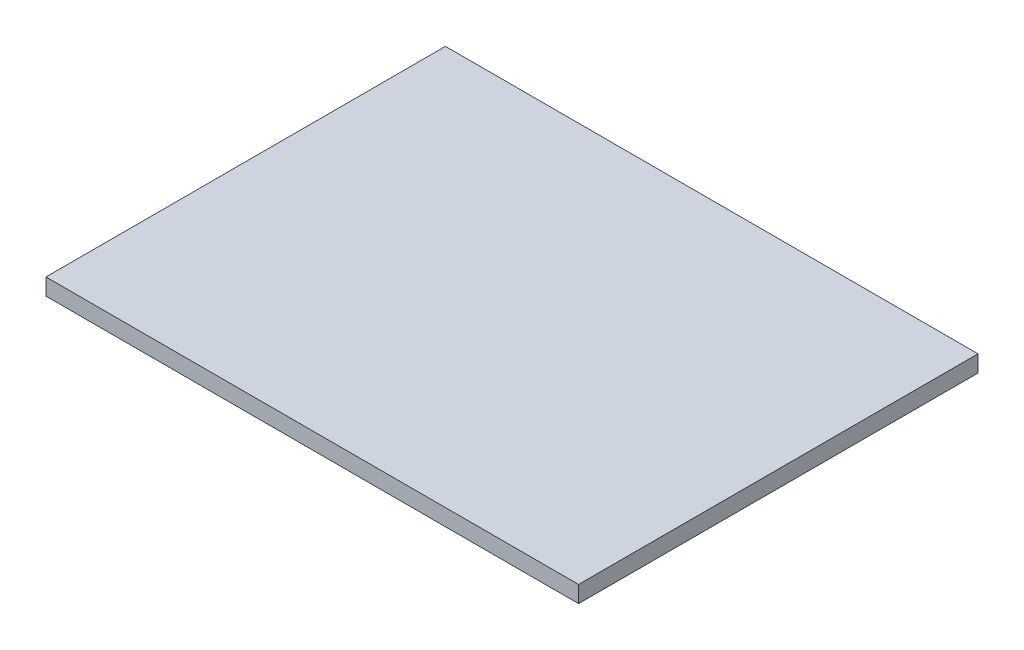
ISO-10303-21;
HEADER;
FILE_DESCRIPTION(('STEP AP214'),'2;1');
FILE_NAME('part.step','',(''),(''),'','','');
FILE_SCHEMA(('AUTOMOTIVE_DESIGN { 1 0 10303 214 1 1 1 1 }'));
ENDSEC;
DATA;
#1=APPLICATION_CONTEXT('core data for automotive mechanical design processes');
#2=APPLICATION_PROTOCOL_DEFINITION('international standard','automotive_design',2000,#1);
#3=PRODUCT_CONTEXT('',#1,'mechanical');
#4=PRODUCT('Part','Part','',(#3));
#5=PRODUCT_RELATED_PRODUCT_CATEGORY('part','',(#4));
#6=PRODUCT_DEFINITION_FORMATION('','',#4);
#7=PRODUCT_DEFINITION_CONTEXT('part definition',#1,'design');
#8=PRODUCT_DEFINITION('design','',#6,#7);
#9=PRODUCT_DEFINITION_SHAPE('','',#8);
#10=(LENGTH_UNIT() NAMED_UNIT(*) SI_UNIT(.MILLI.,.METRE.));
#11=(NAMED_UNIT(*) PLANE_ANGLE_UNIT() SI_UNIT($,.RADIAN.));
#12=(NAMED_UNIT(*) SI_UNIT($,.STERADIAN.) SOLID_ANGLE_UNIT());
#13=UNCERTAINTY_MEASURE_WITH_UNIT(LENGTH_MEASURE(1.E-05),#10,'distance_accuracy_value','');
#14=(GEOMETRIC_REPRESENTATION_CONTEXT(3) GLOBAL_UNCERTAINTY_ASSIGNED_CONTEXT((#13)) GLOBAL_UNIT_ASSIGNED_CONTEXT((#10,
#11,#12)) REPRESENTATION_CONTEXT('',''));
#15=CARTESIAN_POINT('',(0.,0.,0.));
#16=DIRECTION('',(0.,0.,1.));
#17=DIRECTION('',(1.,0.,0.));
#18=AXIS2_PLACEMENT_3D('',#15,#16,#17);
#19=CARTESIAN_POINT('',(0.,1.,0.));
#20=DIRECTION('',(-1.,0.,0.));
#21=DIRECTION('',(0.,0.,1.));
#22=AXIS2_PLACEMENT_3D('',#19,#20,#21);
#23=PLANE('',#22);
#24=DIRECTION('',(0.,0.,-1.));
#25=VECTOR('',#24,1.);
#26=CARTESIAN_POINT('',(0.,0.,0.));
#27=LINE('',#26,#25);
#28=CARTESIAN_POINT('',(0.,0.,24.));
#29=VERTEX_POINT('',#28);
#30=CARTESIAN_POINT('',(0.,0.,0.));
#31=VERTEX_POINT('',#30);
#32=EDGE_CURVE('E113',#29,#31,#27,.T.);
#33=ORIENTED_EDGE('',*,*,#32,.T.);
#34=DIRECTION('',(0.,-1.,0.));
#35=VECTOR('',#34,1.);
#36=CARTESIAN_POINT('',(0.,1.,0.));
#37=LINE('',#36,#35);
#38=CARTESIAN_POINT('',(0.,1.,0.));
#39=VERTEX_POINT('',#38);
#40=EDGE_CURVE('E11',#39,#31,#37,.T.);
#41=ORIENTED_EDGE('',*,*,#40,.F.);
#42=DIRECTION('',(0.,0.,-1.));
#43=VECTOR('',#42,1.);
#44=CARTESIAN_POINT('',(0.,1.,0.));
#45=LINE('',#44,#43);
#46=CARTESIAN_POINT('',(0.,1.,24.));
#47=VERTEX_POINT('',#46);
#48=EDGE_CURVE('E97',#47,#39,#45,.T.);
#49=ORIENTED_EDGE('',*,*,#48,.F.);
#50=DIRECTION('',(0.,-1.,0.));
#51=VECTOR('',#50,1.);
#52=CARTESIAN_POINT('',(0.,1.,24.));
#53=LINE('',#52,#51);
#54=EDGE_CURVE('E109',#47,#29,#53,.T.);
#55=ORIENTED_EDGE('',*,*,#54,.T.);
#56=EDGE_LOOP('',(#33,#41,#49,#55));
#57=FACE_BOUND('',#56,.T.);
#58=ADVANCED_FACE('F45',(#57),#23,.F.);
#59=CARTESIAN_POINT('',(0.,1.,0.));
#60=DIRECTION('',(0.,0.,1.));
#61=DIRECTION('',(1.,0.,0.));
#62=AXIS2_PLACEMENT_3D('',#59,#60,#61);
#63=PLANE('',#62);
#64=DIRECTION('',(-1.,0.,0.));
#65=VECTOR('',#64,1.);
#66=CARTESIAN_POINT('',(0.,0.,0.));
#67=LINE('',#66,#65);
#68=CARTESIAN_POINT('',(-32.,0.,0.));
#69=VERTEX_POINT('',#68);
#70=EDGE_CURVE('E102',#31,#69,#67,.T.);
#71=ORIENTED_EDGE('',*,*,#70,.T.);
#72=DIRECTION('',(0.,-1.,0.));
#73=VECTOR('',#72,1.);
#74=CARTESIAN_POINT('',(-32.,1.,0.));
#75=LINE('',#74,#73);
#76=CARTESIAN_POINT('',(-32.,1.,0.));
#77=VERTEX_POINT('',#76);
#78=EDGE_CURVE('E54',#77,#69,#75,.T.);
#79=ORIENTED_EDGE('',*,*,#78,.F.);
#80=DIRECTION('',(-1.,0.,0.));
#81=VECTOR('',#80,1.);
#82=CARTESIAN_POINT('',(0.,1.,0.));
#83=LINE('',#82,#81);
#84=EDGE_CURVE('E92',#39,#77,#83,.T.);
#85=ORIENTED_EDGE('',*,*,#84,.F.);
#86=ORIENTED_EDGE('',*,*,#40,.T.);
#87=EDGE_LOOP('',(#71,#79,#85,#86));
#88=FACE_BOUND('',#87,.T.);
#89=ADVANCED_FACE('F101',(#88),#63,.F.);
#90=CARTESIAN_POINT('',(-32.,1.,0.));
#91=DIRECTION('',(1.,0.,0.));
#92=DIRECTION('',(0.,0.,-1.));
#93=AXIS2_PLACEMENT_3D('',#90,#91,#92);
#94=PLANE('',#93);
#95=DIRECTION('',(0.,0.,1.));
#96=VECTOR('',#95,1.);
#97=CARTESIAN_POINT('',(-32.,0.,0.));
#98=LINE('',#97,#96);
#99=CARTESIAN_POINT('',(-32.,0.,24.));
#100=VERTEX_POINT('',#99);
#101=EDGE_CURVE('E79',#69,#100,#98,.T.);
#102=ORIENTED_EDGE('',*,*,#101,.T.);
#103=DIRECTION('',(0.,-1.,0.));
#104=VECTOR('',#103,1.);
#105=CARTESIAN_POINT('',(-32.,1.,24.));
#106=LINE('',#105,#104);
#107=CARTESIAN_POINT('',(-32.,1.,24.));
#108=VERTEX_POINT('',#107);
#109=EDGE_CURVE('E104',#108,#100,#106,.T.);
#110=ORIENTED_EDGE('',*,*,#109,.F.);
#111=DIRECTION('',(0.,0.,1.));
#112=VECTOR('',#111,1.);
#113=CARTESIAN_POINT('',(-32.,1.,0.));
#114=LINE('',#113,#112);
#115=EDGE_CURVE('E95',#77,#108,#114,.T.);
#116=ORIENTED_EDGE('',*,*,#115,.F.);
#117=ORIENTED_EDGE('',*,*,#78,.T.);
#118=EDGE_LOOP('',(#102,#110,#116,#117));
#119=FACE_BOUND('',#118,.T.);
#120=ADVANCED_FACE('F105',(#119),#94,.F.);
#121=CARTESIAN_POINT('',(0.,1.,24.));
#122=DIRECTION('',(0.,0.,-1.));
#123=DIRECTION('',(-1.,0.,0.));
#124=AXIS2_PLACEMENT_3D('',#121,#122,#123);
#125=PLANE('',#124);
#126=DIRECTION('',(1.,0.,0.));
#127=VECTOR('',#126,1.);
#128=CARTESIAN_POINT('',(0.,0.,24.));
#129=LINE('',#128,#127);
#130=EDGE_CURVE('E85',#100,#29,#129,.T.);
#131=ORIENTED_EDGE('',*,*,#130,.T.);
#132=ORIENTED_EDGE('',*,*,#54,.F.);
#133=DIRECTION('',(1.,0.,0.));
#134=VECTOR('',#133,1.);
#135=CARTESIAN_POINT('',(0.,1.,24.));
#136=LINE('',#135,#134);
#137=EDGE_CURVE('E62',#108,#47,#136,.T.);
#138=ORIENTED_EDGE('',*,*,#137,.F.);
#139=ORIENTED_EDGE('',*,*,#109,.T.);
#140=EDGE_LOOP('',(#131,#132,#138,#139));
#141=FACE_BOUND('',#140,.T.);
#142=ADVANCED_FACE('F126',(#141),#125,.F.);
#143=CARTESIAN_POINT('',(0.,1.,0.));
#144=DIRECTION('',(0.,-1.,0.));
#145=DIRECTION('',(0.,0.,-1.));
#146=AXIS2_PLACEMENT_3D('',#143,#144,#145);
#147=PLANE('',#146);
#148=ORIENTED_EDGE('',*,*,#48,.T.);
#149=ORIENTED_EDGE('',*,*,#84,.T.);
#150=ORIENTED_EDGE('',*,*,#115,.T.);
#151=ORIENTED_EDGE('',*,*,#137,.T.);
#152=EDGE_LOOP('',(#148,#149,#150,#151));
#153=FACE_BOUND('',#152,.T.);
#154=ADVANCED_FACE('F93',(#153),#147,.F.);
#155=CARTESIAN_POINT('',(0.,0.,0.));
#156=DIRECTION('',(0.,-1.,0.));
#157=DIRECTION('',(0.,0.,-1.));
#158=AXIS2_PLACEMENT_3D('',#155,#156,#157);
#159=PLANE('',#158);
#160=ORIENTED_EDGE('',*,*,#32,.F.);
#161=ORIENTED_EDGE('',*,*,#130,.F.);
#162=ORIENTED_EDGE('',*,*,#101,.F.);
#163=ORIENTED_EDGE('',*,*,#70,.F.);
#164=EDGE_LOOP('',(#160,#161,#162,#163));
#165=FACE_BOUND('',#164,.T.);
#166=ADVANCED_FACE('F129',(#165),#159,.T.);
#167=CLOSED_SHELL('',(#58,#89,#120,#142,#154,#166));
#168=MANIFOLD_SOLID_BREP('B2',#167);
#169=ADVANCED_BREP_SHAPE_REPRESENTATION('',(#18,#168),#14);
#170=SHAPE_DEFINITION_REPRESENTATION(#9,#169);
ENDSEC;
END-ISO-10303-21;
